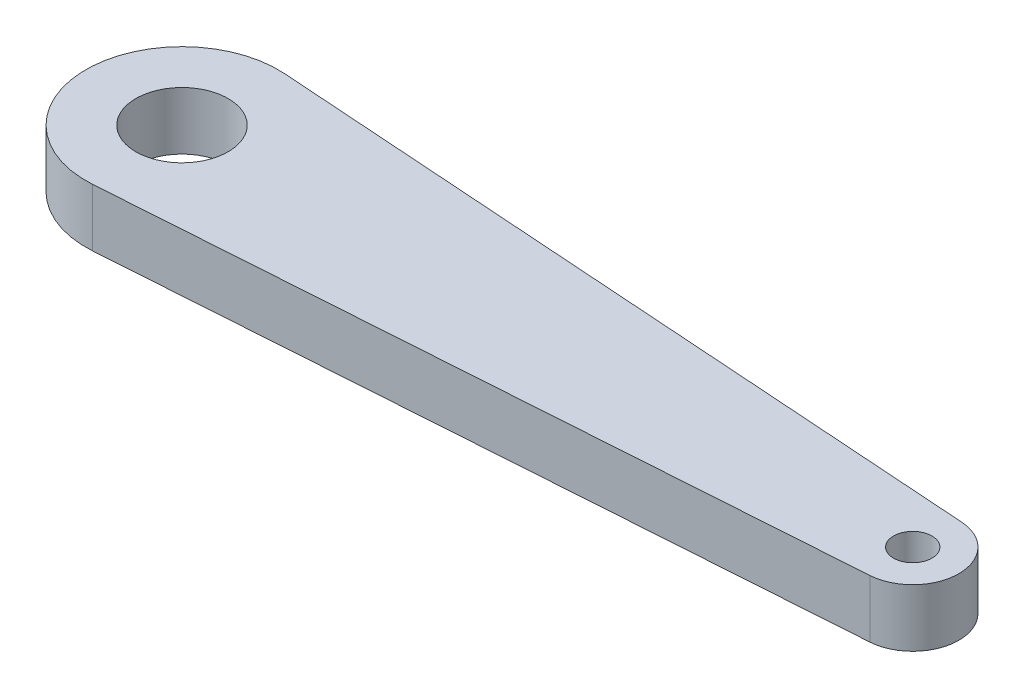
ISO-10303-21;
HEADER;
FILE_DESCRIPTION(('STEP AP214'),'2;1');
FILE_NAME('part.step','',(''),(''),'','','');
FILE_SCHEMA(('AUTOMOTIVE_DESIGN { 1 0 10303 214 1 1 1 1 }'));
ENDSEC;
DATA;
#1=APPLICATION_CONTEXT('core data for automotive mechanical design processes');
#2=APPLICATION_PROTOCOL_DEFINITION('international standard','automotive_design',2000,#1);
#3=PRODUCT_CONTEXT('',#1,'mechanical');
#4=PRODUCT('Part','Part','',(#3));
#5=PRODUCT_RELATED_PRODUCT_CATEGORY('part','',(#4));
#6=PRODUCT_DEFINITION_FORMATION('','',#4);
#7=PRODUCT_DEFINITION_CONTEXT('part definition',#1,'design');
#8=PRODUCT_DEFINITION('design','',#6,#7);
#9=PRODUCT_DEFINITION_SHAPE('','',#8);
#10=(LENGTH_UNIT() NAMED_UNIT(*) SI_UNIT(.MILLI.,.METRE.));
#11=(NAMED_UNIT(*) PLANE_ANGLE_UNIT() SI_UNIT($,.RADIAN.));
#12=(NAMED_UNIT(*) SI_UNIT($,.STERADIAN.) SOLID_ANGLE_UNIT());
#13=UNCERTAINTY_MEASURE_WITH_UNIT(LENGTH_MEASURE(1.E-05),#10,'distance_accuracy_value','');
#14=(GEOMETRIC_REPRESENTATION_CONTEXT(3) GLOBAL_UNCERTAINTY_ASSIGNED_CONTEXT((#13)) GLOBAL_UNIT_ASSIGNED_CONTEXT((#10,
#11,#12)) REPRESENTATION_CONTEXT('',''));
#15=CARTESIAN_POINT('',(0.,0.,0.));
#16=DIRECTION('',(0.,0.,1.));
#17=DIRECTION('',(1.,0.,0.));
#18=AXIS2_PLACEMENT_3D('',#15,#16,#17);
#19=CARTESIAN_POINT('',(-23.9105775527429,7.5,0.));
#20=DIRECTION('',(0.,1.,0.));
#21=DIRECTION('',(0.,0.,1.));
#22=AXIS2_PLACEMENT_3D('',#19,#20,#21);
#23=PLANE('',#22);
#24=CARTESIAN_POINT('',(71.0894224472571,7.5,0.));
#25=DIRECTION('',(0.,1.,0.));
#26=DIRECTION('',(0.,0.,1.));
#27=AXIS2_PLACEMENT_3D('',#24,#25,#26);
#28=CIRCLE('',#27,2.49999999999999);
#29=CARTESIAN_POINT('',(71.0894224472571,7.5,2.49999999999999));
#30=VERTEX_POINT('',#29);
#31=EDGE_CURVE('E110',#30,#30,#28,.T.);
#32=ORIENTED_EDGE('',*,*,#31,.F.);
#33=EDGE_LOOP('',(#32));
#34=FACE_BOUND('',#33,.T.);
#35=CARTESIAN_POINT('',(-23.9105775527429,7.5,0.));
#36=DIRECTION('',(0.,1.,0.));
#37=DIRECTION('',(0.,0.,1.));
#38=AXIS2_PLACEMENT_3D('',#35,#36,#37);
#39=CIRCLE('',#38,12.5);
#40=CARTESIAN_POINT('',(-23.0553143948482,7.5,-12.4707066732703));
#41=VERTEX_POINT('',#40);
#42=CARTESIAN_POINT('',(-23.0553143948482,7.5,12.4707066732703));
#43=VERTEX_POINT('',#42);
#44=EDGE_CURVE('E95',#41,#43,#39,.T.);
#45=ORIENTED_EDGE('',*,*,#44,.T.);
#46=DIRECTION('',(0.997656533861622,0.,-0.0684210526315789));
#47=VECTOR('',#46,1.);
#48=CARTESIAN_POINT('',(-23.0553143948482,7.5,12.4707066732703));
#49=LINE('',#48,#47);
#50=CARTESIAN_POINT('',(71.4999487630466,7.5,5.98593920316974));
#51=VERTEX_POINT('',#50);
#52=EDGE_CURVE('E90',#43,#51,#49,.T.);
#53=ORIENTED_EDGE('',*,*,#52,.T.);
#54=CARTESIAN_POINT('',(71.0894224472571,7.5,0.));
#55=DIRECTION('',(0.,1.,0.));
#56=DIRECTION('',(0.,0.,1.));
#57=AXIS2_PLACEMENT_3D('',#54,#55,#56);
#58=CIRCLE('',#57,6.);
#59=CARTESIAN_POINT('',(71.4999487630466,7.5,-5.98593920316974));
#60=VERTEX_POINT('',#59);
#61=EDGE_CURVE('E93',#51,#60,#58,.T.);
#62=ORIENTED_EDGE('',*,*,#61,.T.);
#63=DIRECTION('',(-0.997656533861622,0.,-0.0684210526315789));
#64=VECTOR('',#63,1.);
#65=CARTESIAN_POINT('',(-23.0553143948482,7.5,-12.4707066732703));
#66=LINE('',#65,#64);
#67=EDGE_CURVE('E60',#60,#41,#66,.T.);
#68=ORIENTED_EDGE('',*,*,#67,.T.);
#69=EDGE_LOOP('',(#45,#53,#62,#68));
#70=FACE_BOUND('',#69,.T.);
#71=CARTESIAN_POINT('',(-23.9105775527429,7.5,0.));
#72=DIRECTION('',(0.,1.,0.));
#73=DIRECTION('',(0.,0.,1.));
#74=AXIS2_PLACEMENT_3D('',#71,#72,#73);
#75=CIRCLE('',#74,6.);
#76=CARTESIAN_POINT('',(-23.9105775527429,7.5,6.));
#77=VERTEX_POINT('',#76);
#78=EDGE_CURVE('E125',#77,#77,#75,.T.);
#79=ORIENTED_EDGE('',*,*,#78,.F.);
#80=EDGE_LOOP('',(#79));
#81=FACE_BOUND('',#80,.T.);
#82=ADVANCED_FACE('F43',(#34,#70,#81),#23,.T.);
#83=CARTESIAN_POINT('',(-23.9105775527429,0.,0.));
#84=DIRECTION('',(0.,1.,0.));
#85=DIRECTION('',(0.,0.,1.));
#86=AXIS2_PLACEMENT_3D('',#83,#84,#85);
#87=PLANE('',#86);
#88=CARTESIAN_POINT('',(-23.9105775527429,0.,0.));
#89=DIRECTION('',(0.,1.,0.));
#90=DIRECTION('',(0.,0.,1.));
#91=AXIS2_PLACEMENT_3D('',#88,#89,#90);
#92=CIRCLE('',#91,12.5);
#93=CARTESIAN_POINT('',(-23.0553143948482,0.,-12.4707066732703));
#94=VERTEX_POINT('',#93);
#95=CARTESIAN_POINT('',(-23.0553143948482,0.,12.4707066732703));
#96=VERTEX_POINT('',#95);
#97=EDGE_CURVE('E107',#94,#96,#92,.T.);
#98=ORIENTED_EDGE('',*,*,#97,.F.);
#99=DIRECTION('',(-0.997656533861622,0.,-0.0684210526315789));
#100=VECTOR('',#99,1.);
#101=CARTESIAN_POINT('',(-23.0553143948482,0.,-12.4707066732703));
#102=LINE('',#101,#100);
#103=CARTESIAN_POINT('',(71.4999487630466,0.,-5.98593920316974));
#104=VERTEX_POINT('',#103);
#105=EDGE_CURVE('E83',#104,#94,#102,.T.);
#106=ORIENTED_EDGE('',*,*,#105,.F.);
#107=CARTESIAN_POINT('',(71.0894224472571,0.,0.));
#108=DIRECTION('',(0.,1.,0.));
#109=DIRECTION('',(0.,0.,1.));
#110=AXIS2_PLACEMENT_3D('',#107,#108,#109);
#111=CIRCLE('',#110,6.);
#112=CARTESIAN_POINT('',(71.4999487630466,0.,5.98593920316974));
#113=VERTEX_POINT('',#112);
#114=EDGE_CURVE('E77',#113,#104,#111,.T.);
#115=ORIENTED_EDGE('',*,*,#114,.F.);
#116=DIRECTION('',(0.997656533861622,0.,-0.0684210526315789));
#117=VECTOR('',#116,1.);
#118=CARTESIAN_POINT('',(-23.0553143948482,0.,12.4707066732703));
#119=LINE('',#118,#117);
#120=EDGE_CURVE('E99',#96,#113,#119,.T.);
#121=ORIENTED_EDGE('',*,*,#120,.F.);
#122=EDGE_LOOP('',(#98,#106,#115,#121));
#123=FACE_BOUND('',#122,.T.);
#124=CARTESIAN_POINT('',(71.0894224472571,0.,0.));
#125=DIRECTION('',(0.,1.,0.));
#126=DIRECTION('',(0.,0.,1.));
#127=AXIS2_PLACEMENT_3D('',#124,#125,#126);
#128=CIRCLE('',#127,2.49999999999999);
#129=CARTESIAN_POINT('',(71.0894224472571,0.,2.49999999999999));
#130=VERTEX_POINT('',#129);
#131=EDGE_CURVE('E122',#130,#130,#128,.T.);
#132=ORIENTED_EDGE('',*,*,#131,.T.);
#133=EDGE_LOOP('',(#132));
#134=FACE_BOUND('',#133,.T.);
#135=CARTESIAN_POINT('',(-23.9105775527429,0.,0.));
#136=DIRECTION('',(0.,1.,0.));
#137=DIRECTION('',(0.,0.,1.));
#138=AXIS2_PLACEMENT_3D('',#135,#136,#137);
#139=CIRCLE('',#138,6.);
#140=CARTESIAN_POINT('',(-23.9105775527429,0.,6.));
#141=VERTEX_POINT('',#140);
#142=EDGE_CURVE('E128',#141,#141,#139,.T.);
#143=ORIENTED_EDGE('',*,*,#142,.T.);
#144=EDGE_LOOP('',(#143));
#145=FACE_BOUND('',#144,.T.);
#146=ADVANCED_FACE('F118',(#123,#134,#145),#87,.F.);
#147=CARTESIAN_POINT('',(-23.9105775527429,7.5,0.));
#148=DIRECTION('',(0.,-1.,0.));
#149=DIRECTION('',(0.,0.,-1.));
#150=AXIS2_PLACEMENT_3D('',#147,#148,#149);
#151=CYLINDRICAL_SURFACE('',#150,12.5);
#152=ORIENTED_EDGE('',*,*,#97,.T.);
#153=DIRECTION('',(0.,-1.,0.));
#154=VECTOR('',#153,1.);
#155=CARTESIAN_POINT('',(-23.0553143948482,7.5,12.4707066732703));
#156=LINE('',#155,#154);
#157=EDGE_CURVE('E11',#43,#96,#156,.T.);
#158=ORIENTED_EDGE('',*,*,#157,.F.);
#159=ORIENTED_EDGE('',*,*,#44,.F.);
#160=DIRECTION('',(0.,-1.,0.));
#161=VECTOR('',#160,1.);
#162=CARTESIAN_POINT('',(-23.0553143948482,7.5,-12.4707066732703));
#163=LINE('',#162,#161);
#164=EDGE_CURVE('E103',#41,#94,#163,.T.);
#165=ORIENTED_EDGE('',*,*,#164,.T.);
#166=EDGE_LOOP('',(#152,#158,#159,#165));
#167=FACE_BOUND('',#166,.T.);
#168=ADVANCED_FACE('F45',(#167),#151,.T.);
#169=CARTESIAN_POINT('',(-23.0553143948482,7.5,12.4707066732703));
#170=DIRECTION('',(-0.0684210526315789,0.,-0.997656533861622));
#171=DIRECTION('',(-0.997656533861623,0.,0.068421052631579));
#172=AXIS2_PLACEMENT_3D('',#169,#170,#171);
#173=PLANE('',#172);
#174=ORIENTED_EDGE('',*,*,#120,.T.);
#175=DIRECTION('',(0.,-1.,0.));
#176=VECTOR('',#175,1.);
#177=CARTESIAN_POINT('',(71.4999487630466,7.5,5.98593920316974));
#178=LINE('',#177,#176);
#179=EDGE_CURVE('E52',#51,#113,#178,.T.);
#180=ORIENTED_EDGE('',*,*,#179,.F.);
#181=ORIENTED_EDGE('',*,*,#52,.F.);
#182=ORIENTED_EDGE('',*,*,#157,.T.);
#183=EDGE_LOOP('',(#174,#180,#181,#182));
#184=FACE_BOUND('',#183,.T.);
#185=ADVANCED_FACE('F98',(#184),#173,.F.);
#186=CARTESIAN_POINT('',(71.0894224472571,7.5,0.));
#187=DIRECTION('',(0.,-1.,0.));
#188=DIRECTION('',(0.,0.,-1.));
#189=AXIS2_PLACEMENT_3D('',#186,#187,#188);
#190=CYLINDRICAL_SURFACE('',#189,6.);
#191=ORIENTED_EDGE('',*,*,#114,.T.);
#192=DIRECTION('',(0.,-1.,0.));
#193=VECTOR('',#192,1.);
#194=CARTESIAN_POINT('',(71.4999487630466,7.5,-5.98593920316974));
#195=LINE('',#194,#193);
#196=EDGE_CURVE('E100',#60,#104,#195,.T.);
#197=ORIENTED_EDGE('',*,*,#196,.F.);
#198=ORIENTED_EDGE('',*,*,#61,.F.);
#199=ORIENTED_EDGE('',*,*,#179,.T.);
#200=EDGE_LOOP('',(#191,#197,#198,#199));
#201=FACE_BOUND('',#200,.T.);
#202=ADVANCED_FACE('F101',(#201),#190,.T.);
#203=CARTESIAN_POINT('',(-23.0553143948482,7.5,-12.4707066732703));
#204=DIRECTION('',(-0.0684210526315789,0.,0.997656533861622));
#205=DIRECTION('',(0.997656533861623,0.,0.068421052631579));
#206=AXIS2_PLACEMENT_3D('',#203,#204,#205);
#207=PLANE('',#206);
#208=ORIENTED_EDGE('',*,*,#105,.T.);
#209=ORIENTED_EDGE('',*,*,#164,.F.);
#210=ORIENTED_EDGE('',*,*,#67,.F.);
#211=ORIENTED_EDGE('',*,*,#196,.T.);
#212=EDGE_LOOP('',(#208,#209,#210,#211));
#213=FACE_BOUND('',#212,.T.);
#214=ADVANCED_FACE('F115',(#213),#207,.F.);
#215=CARTESIAN_POINT('',(71.0894224472571,7.5,0.));
#216=DIRECTION('',(0.,-1.,0.));
#217=DIRECTION('',(0.,0.,-1.));
#218=AXIS2_PLACEMENT_3D('',#215,#216,#217);
#219=CYLINDRICAL_SURFACE('',#218,2.49999999999999);
#220=ORIENTED_EDGE('',*,*,#31,.T.);
#221=EDGE_LOOP('',(#220));
#222=FACE_BOUND('',#221,.T.);
#223=ORIENTED_EDGE('',*,*,#131,.F.);
#224=EDGE_LOOP('',(#223));
#225=FACE_BOUND('',#224,.T.);
#226=ADVANCED_FACE('F145',(#222,#225),#219,.F.);
#227=CARTESIAN_POINT('',(-23.9105775527429,7.5,0.));
#228=DIRECTION('',(0.,-1.,0.));
#229=DIRECTION('',(0.,0.,-1.));
#230=AXIS2_PLACEMENT_3D('',#227,#228,#229);
#231=CYLINDRICAL_SURFACE('',#230,6.);
#232=ORIENTED_EDGE('',*,*,#78,.T.);
#233=EDGE_LOOP('',(#232));
#234=FACE_BOUND('',#233,.T.);
#235=ORIENTED_EDGE('',*,*,#142,.F.);
#236=EDGE_LOOP('',(#235));
#237=FACE_BOUND('',#236,.T.);
#238=ADVANCED_FACE('F134',(#234,#237),#231,.F.);
#239=CLOSED_SHELL('',(#82,#146,#168,#185,#202,#214,#226,#238));
#240=MANIFOLD_SOLID_BREP('B2',#239);
#241=ADVANCED_BREP_SHAPE_REPRESENTATION('',(#18,#240),#14);
#242=SHAPE_DEFINITION_REPRESENTATION(#9,#241);
ENDSEC;
END-ISO-10303-21;
